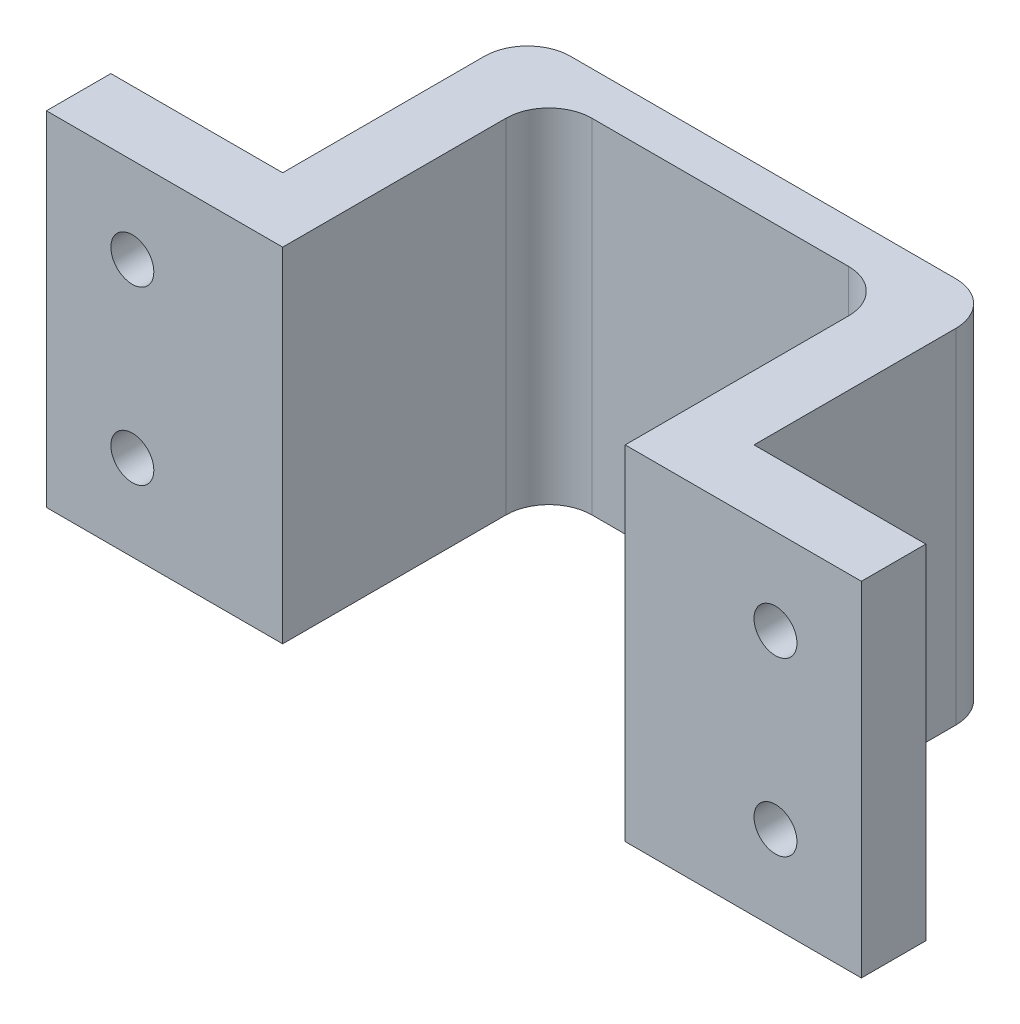
ISO-10303-21;
HEADER;
FILE_DESCRIPTION(('STEP AP214'),'2;1');
FILE_NAME('part.step','',(''),(''),'','','');
FILE_SCHEMA(('AUTOMOTIVE_DESIGN { 1 0 10303 214 1 1 1 1 }'));
ENDSEC;
DATA;
#1=APPLICATION_CONTEXT('core data for automotive mechanical design processes');
#2=APPLICATION_PROTOCOL_DEFINITION('international standard','automotive_design',2000,#1);
#3=PRODUCT_CONTEXT('',#1,'mechanical');
#4=PRODUCT('Part','Part','',(#3));
#5=PRODUCT_RELATED_PRODUCT_CATEGORY('part','',(#4));
#6=PRODUCT_DEFINITION_FORMATION('','',#4);
#7=PRODUCT_DEFINITION_CONTEXT('part definition',#1,'design');
#8=PRODUCT_DEFINITION('design','',#6,#7);
#9=PRODUCT_DEFINITION_SHAPE('','',#8);
#10=(LENGTH_UNIT() NAMED_UNIT(*) SI_UNIT(.MILLI.,.METRE.));
#11=(NAMED_UNIT(*) PLANE_ANGLE_UNIT() SI_UNIT($,.RADIAN.));
#12=(NAMED_UNIT(*) SI_UNIT($,.STERADIAN.) SOLID_ANGLE_UNIT());
#13=UNCERTAINTY_MEASURE_WITH_UNIT(LENGTH_MEASURE(1.E-05),#10,'distance_accuracy_value','');
#14=(GEOMETRIC_REPRESENTATION_CONTEXT(3) GLOBAL_UNCERTAINTY_ASSIGNED_CONTEXT((#13)) GLOBAL_UNIT_ASSIGNED_CONTEXT((#10,
#11,#12)) REPRESENTATION_CONTEXT('',''));
#15=CARTESIAN_POINT('',(0.,0.,0.));
#16=DIRECTION('',(0.,0.,1.));
#17=DIRECTION('',(1.,0.,0.));
#18=AXIS2_PLACEMENT_3D('',#15,#16,#17);
#19=CARTESIAN_POINT('',(0.,0.,2.));
#20=DIRECTION('',(1.,0.,0.));
#21=DIRECTION('',(0.,0.,-1.));
#22=AXIS2_PLACEMENT_3D('',#19,#20,#21);
#23=PLANE('',#22);
#24=DIRECTION('',(0.,0.,-1.));
#25=VECTOR('',#24,1.);
#26=CARTESIAN_POINT('',(0.,16.,2.));
#27=LINE('',#26,#25);
#28=CARTESIAN_POINT('',(0.,16.,11.4));
#29=VERTEX_POINT('',#28);
#30=CARTESIAN_POINT('',(0.,16.,2.));
#31=VERTEX_POINT('',#30);
#32=EDGE_CURVE('E234',#29,#31,#27,.T.);
#33=ORIENTED_EDGE('',*,*,#32,.T.);
#34=DIRECTION('',(0.,-1.,0.));
#35=VECTOR('',#34,1.);
#36=CARTESIAN_POINT('',(0.,0.,2.));
#37=LINE('',#36,#35);
#38=CARTESIAN_POINT('',(0.,0.,2.));
#39=VERTEX_POINT('',#38);
#40=EDGE_CURVE('E267',#31,#39,#37,.T.);
#41=ORIENTED_EDGE('',*,*,#40,.T.);
#42=DIRECTION('',(0.,0.,-1.));
#43=VECTOR('',#42,1.);
#44=CARTESIAN_POINT('',(0.,0.,2.));
#45=LINE('',#44,#43);
#46=CARTESIAN_POINT('',(0.,0.,11.4));
#47=VERTEX_POINT('',#46);
#48=EDGE_CURVE('E246',#47,#39,#45,.T.);
#49=ORIENTED_EDGE('',*,*,#48,.F.);
#50=DIRECTION('',(0.,-1.,0.));
#51=VECTOR('',#50,1.);
#52=CARTESIAN_POINT('',(0.,0.,11.4));
#53=LINE('',#52,#51);
#54=EDGE_CURVE('E174',#29,#47,#53,.T.);
#55=ORIENTED_EDGE('',*,*,#54,.F.);
#56=EDGE_LOOP('',(#33,#41,#49,#55));
#57=FACE_BOUND('',#56,.T.);
#58=ADVANCED_FACE('F33',(#57),#23,.F.);
#59=CARTESIAN_POINT('',(21.95,0.,2.));
#60=DIRECTION('',(-1.,0.,0.));
#61=DIRECTION('',(0.,0.,1.));
#62=AXIS2_PLACEMENT_3D('',#59,#60,#61);
#63=PLANE('',#62);
#64=DIRECTION('',(0.,0.,-1.));
#65=VECTOR('',#64,1.);
#66=CARTESIAN_POINT('',(21.95,0.,2.));
#67=LINE('',#66,#65);
#68=CARTESIAN_POINT('',(21.95,0.,11.4));
#69=VERTEX_POINT('',#68);
#70=CARTESIAN_POINT('',(21.95,0.,2.));
#71=VERTEX_POINT('',#70);
#72=EDGE_CURVE('E243',#69,#71,#67,.T.);
#73=ORIENTED_EDGE('',*,*,#72,.T.);
#74=DIRECTION('',(0.,1.,0.));
#75=VECTOR('',#74,1.);
#76=CARTESIAN_POINT('',(21.95,16.,2.));
#77=LINE('',#76,#75);
#78=CARTESIAN_POINT('',(21.95,16.,2.));
#79=VERTEX_POINT('',#78);
#80=EDGE_CURVE('E11',#71,#79,#77,.T.);
#81=ORIENTED_EDGE('',*,*,#80,.T.);
#82=DIRECTION('',(0.,0.,-1.));
#83=VECTOR('',#82,1.);
#84=CARTESIAN_POINT('',(21.95,16.,2.));
#85=LINE('',#84,#83);
#86=CARTESIAN_POINT('',(21.95,16.,11.4));
#87=VERTEX_POINT('',#86);
#88=EDGE_CURVE('E240',#87,#79,#85,.T.);
#89=ORIENTED_EDGE('',*,*,#88,.F.);
#90=DIRECTION('',(0.,1.,0.));
#91=VECTOR('',#90,1.);
#92=CARTESIAN_POINT('',(21.95,16.,11.4));
#93=LINE('',#92,#91);
#94=EDGE_CURVE('E188',#69,#87,#93,.T.);
#95=ORIENTED_EDGE('',*,*,#94,.F.);
#96=EDGE_LOOP('',(#73,#81,#89,#95));
#97=FACE_BOUND('',#96,.T.);
#98=ADVANCED_FACE('F289',(#97),#63,.F.);
#99=CARTESIAN_POINT('',(0.,0.,2.));
#100=DIRECTION('',(0.,0.,-1.));
#101=DIRECTION('',(-1.,0.,0.));
#102=AXIS2_PLACEMENT_3D('',#99,#100,#101);
#103=PLANE('',#102);
#104=DIRECTION('',(-1.,0.,0.));
#105=VECTOR('',#104,1.);
#106=CARTESIAN_POINT('',(0.,16.,2.));
#107=LINE('',#106,#105);
#108=CARTESIAN_POINT('',(16.95,16.,2.));
#109=VERTEX_POINT('',#108);
#110=CARTESIAN_POINT('',(5.,16.,2.));
#111=VERTEX_POINT('',#110);
#112=EDGE_CURVE('E230',#109,#111,#107,.T.);
#113=ORIENTED_EDGE('',*,*,#112,.T.);
#114=DIRECTION('',(0.,1.,0.));
#115=VECTOR('',#114,1.);
#116=CARTESIAN_POINT('',(5.,0.,2.));
#117=LINE('',#116,#115);
#118=CARTESIAN_POINT('',(5.,0.,2.));
#119=VERTEX_POINT('',#118);
#120=EDGE_CURVE('E254',#111,#119,#117,.F.);
#121=ORIENTED_EDGE('',*,*,#120,.T.);
#122=DIRECTION('',(1.,0.,0.));
#123=VECTOR('',#122,1.);
#124=CARTESIAN_POINT('',(0.,0.,2.));
#125=LINE('',#124,#123);
#126=CARTESIAN_POINT('',(16.95,0.,2.));
#127=VERTEX_POINT('',#126);
#128=EDGE_CURVE('E227',#119,#127,#125,.T.);
#129=ORIENTED_EDGE('',*,*,#128,.T.);
#130=DIRECTION('',(0.,-1.,0.));
#131=VECTOR('',#130,1.);
#132=CARTESIAN_POINT('',(16.95,16.,2.));
#133=LINE('',#132,#131);
#134=EDGE_CURVE('E252',#127,#109,#133,.F.);
#135=ORIENTED_EDGE('',*,*,#134,.T.);
#136=EDGE_LOOP('',(#113,#121,#129,#135));
#137=FACE_BOUND('',#136,.T.);
#138=ADVANCED_FACE('F315',(#137),#103,.F.);
#139=CARTESIAN_POINT('',(0.,0.,2.));
#140=DIRECTION('',(0.,1.,0.));
#141=DIRECTION('',(0.,0.,1.));
#142=AXIS2_PLACEMENT_3D('',#139,#140,#141);
#143=PLANE('',#142);
#144=ORIENTED_EDGE('',*,*,#48,.T.);
#145=CARTESIAN_POINT('',(2.,0.,2.));
#146=DIRECTION('',(0.,1.,0.));
#147=DIRECTION('',(0.,0.,1.));
#148=AXIS2_PLACEMENT_3D('',#145,#146,#147);
#149=CIRCLE('',#148,2.);
#150=CARTESIAN_POINT('',(2.,0.,0.));
#151=VERTEX_POINT('',#150);
#152=EDGE_CURVE('E272',#39,#151,#149,.F.);
#153=ORIENTED_EDGE('',*,*,#152,.T.);
#154=DIRECTION('',(1.,0.,0.));
#155=VECTOR('',#154,1.);
#156=CARTESIAN_POINT('',(0.,0.,0.));
#157=LINE('',#156,#155);
#158=CARTESIAN_POINT('',(19.95,0.,0.));
#159=VERTEX_POINT('',#158);
#160=EDGE_CURVE('E226',#151,#159,#157,.T.);
#161=ORIENTED_EDGE('',*,*,#160,.T.);
#162=CARTESIAN_POINT('',(19.95,0.,2.));
#163=DIRECTION('',(0.,1.,0.));
#164=DIRECTION('',(0.,0.,1.));
#165=AXIS2_PLACEMENT_3D('',#162,#163,#164);
#166=CIRCLE('',#165,2.);
#167=EDGE_CURVE('E270',#159,#71,#166,.F.);
#168=ORIENTED_EDGE('',*,*,#167,.T.);
#169=ORIENTED_EDGE('',*,*,#72,.F.);
#170=DIRECTION('',(-1.,0.,0.));
#171=VECTOR('',#170,1.);
#172=CARTESIAN_POINT('',(29.95,0.,11.4));
#173=LINE('',#172,#171);
#174=CARTESIAN_POINT('',(29.95,0.,11.4));
#175=VERTEX_POINT('',#174);
#176=EDGE_CURVE('E204',#175,#69,#173,.T.);
#177=ORIENTED_EDGE('',*,*,#176,.F.);
#178=DIRECTION('',(0.,0.,-1.));
#179=VECTOR('',#178,1.);
#180=CARTESIAN_POINT('',(29.95,0.,14.4));
#181=LINE('',#180,#179);
#182=CARTESIAN_POINT('',(29.95,0.,14.4));
#183=VERTEX_POINT('',#182);
#184=EDGE_CURVE('E192',#183,#175,#181,.T.);
#185=ORIENTED_EDGE('',*,*,#184,.F.);
#186=DIRECTION('',(1.,0.,0.));
#187=VECTOR('',#186,1.);
#188=CARTESIAN_POINT('',(21.95,0.,14.4));
#189=LINE('',#188,#187);
#190=CARTESIAN_POINT('',(18.95,0.,14.4));
#191=VERTEX_POINT('',#190);
#192=EDGE_CURVE('E211',#191,#183,#189,.T.);
#193=ORIENTED_EDGE('',*,*,#192,.F.);
#194=DIRECTION('',(0.,0.,-1.));
#195=VECTOR('',#194,1.);
#196=CARTESIAN_POINT('',(18.95,0.,14.4));
#197=LINE('',#196,#195);
#198=CARTESIAN_POINT('',(18.95,0.,4.));
#199=VERTEX_POINT('',#198);
#200=EDGE_CURVE('E213',#191,#199,#197,.T.);
#201=ORIENTED_EDGE('',*,*,#200,.T.);
#202=CARTESIAN_POINT('',(16.95,0.,4.));
#203=DIRECTION('',(0.,1.,0.));
#204=DIRECTION('',(0.,0.,1.));
#205=AXIS2_PLACEMENT_3D('',#202,#203,#204);
#206=CIRCLE('',#205,2.);
#207=EDGE_CURVE('E263',#199,#127,#206,.T.);
#208=ORIENTED_EDGE('',*,*,#207,.T.);
#209=ORIENTED_EDGE('',*,*,#128,.F.);
#210=CARTESIAN_POINT('',(5.,0.,4.));
#211=DIRECTION('',(0.,1.,0.));
#212=DIRECTION('',(0.,0.,1.));
#213=AXIS2_PLACEMENT_3D('',#210,#211,#212);
#214=CIRCLE('',#213,2.);
#215=CARTESIAN_POINT('',(3.,0.,4.));
#216=VERTEX_POINT('',#215);
#217=EDGE_CURVE('E261',#119,#216,#214,.T.);
#218=ORIENTED_EDGE('',*,*,#217,.T.);
#219=DIRECTION('',(0.,0.,-1.));
#220=VECTOR('',#219,1.);
#221=CARTESIAN_POINT('',(3.,0.,14.4));
#222=LINE('',#221,#220);
#223=CARTESIAN_POINT('',(3.,0.,14.4));
#224=VERTEX_POINT('',#223);
#225=EDGE_CURVE('E223',#224,#216,#222,.T.);
#226=ORIENTED_EDGE('',*,*,#225,.F.);
#227=DIRECTION('',(1.,0.,0.));
#228=VECTOR('',#227,1.);
#229=CARTESIAN_POINT('',(0.,0.,14.4));
#230=LINE('',#229,#228);
#231=CARTESIAN_POINT('',(-8.,0.,14.4));
#232=VERTEX_POINT('',#231);
#233=EDGE_CURVE('E219',#232,#224,#230,.T.);
#234=ORIENTED_EDGE('',*,*,#233,.F.);
#235=DIRECTION('',(0.,0.,1.));
#236=VECTOR('',#235,1.);
#237=CARTESIAN_POINT('',(-8.,0.,14.4));
#238=LINE('',#237,#236);
#239=CARTESIAN_POINT('',(-8.,0.,11.4));
#240=VERTEX_POINT('',#239);
#241=EDGE_CURVE('E173',#240,#232,#238,.T.);
#242=ORIENTED_EDGE('',*,*,#241,.F.);
#243=DIRECTION('',(1.,0.,0.));
#244=VECTOR('',#243,1.);
#245=CARTESIAN_POINT('',(-8.,0.,11.4));
#246=LINE('',#245,#244);
#247=EDGE_CURVE('E183',#240,#47,#246,.T.);
#248=ORIENTED_EDGE('',*,*,#247,.T.);
#249=EDGE_LOOP('',(#144,#153,#161,#168,#169,#177,#185,#193,#201,#208,#209,#218,#226,#234,#242,#248));
#250=FACE_BOUND('',#249,.T.);
#251=ADVANCED_FACE('F283',(#250),#143,.F.);
#252=CARTESIAN_POINT('',(0.,16.,2.));
#253=DIRECTION('',(0.,-1.,0.));
#254=DIRECTION('',(0.,0.,-1.));
#255=AXIS2_PLACEMENT_3D('',#252,#253,#254);
#256=PLANE('',#255);
#257=DIRECTION('',(-1.,0.,0.));
#258=VECTOR('',#257,1.);
#259=CARTESIAN_POINT('',(0.,16.,0.));
#260=LINE('',#259,#258);
#261=CARTESIAN_POINT('',(19.95,16.,0.));
#262=VERTEX_POINT('',#261);
#263=CARTESIAN_POINT('',(2.,16.,0.));
#264=VERTEX_POINT('',#263);
#265=EDGE_CURVE('E231',#262,#264,#260,.T.);
#266=ORIENTED_EDGE('',*,*,#265,.T.);
#267=CARTESIAN_POINT('',(2.,16.,2.));
#268=DIRECTION('',(0.,-1.,0.));
#269=DIRECTION('',(0.,0.,-1.));
#270=AXIS2_PLACEMENT_3D('',#267,#268,#269);
#271=CIRCLE('',#270,2.);
#272=EDGE_CURVE('E41',#264,#31,#271,.F.);
#273=ORIENTED_EDGE('',*,*,#272,.T.);
#274=ORIENTED_EDGE('',*,*,#32,.F.);
#275=DIRECTION('',(1.,0.,0.));
#276=VECTOR('',#275,1.);
#277=CARTESIAN_POINT('',(-8.,16.,11.4));
#278=LINE('',#277,#276);
#279=CARTESIAN_POINT('',(-8.,16.,11.4));
#280=VERTEX_POINT('',#279);
#281=EDGE_CURVE('E165',#280,#29,#278,.T.);
#282=ORIENTED_EDGE('',*,*,#281,.F.);
#283=DIRECTION('',(0.,0.,-1.));
#284=VECTOR('',#283,1.);
#285=CARTESIAN_POINT('',(-8.,16.,14.4));
#286=LINE('',#285,#284);
#287=CARTESIAN_POINT('',(-8.,16.,14.4));
#288=VERTEX_POINT('',#287);
#289=EDGE_CURVE('E161',#288,#280,#286,.T.);
#290=ORIENTED_EDGE('',*,*,#289,.F.);
#291=DIRECTION('',(-1.,0.,0.));
#292=VECTOR('',#291,1.);
#293=CARTESIAN_POINT('',(0.,16.,14.4));
#294=LINE('',#293,#292);
#295=CARTESIAN_POINT('',(3.,16.,14.4));
#296=VERTEX_POINT('',#295);
#297=EDGE_CURVE('E148',#296,#288,#294,.T.);
#298=ORIENTED_EDGE('',*,*,#297,.F.);
#299=DIRECTION('',(0.,0.,-1.));
#300=VECTOR('',#299,1.);
#301=CARTESIAN_POINT('',(3.,16.,14.4));
#302=LINE('',#301,#300);
#303=CARTESIAN_POINT('',(3.,16.,4.));
#304=VERTEX_POINT('',#303);
#305=EDGE_CURVE('E158',#296,#304,#302,.T.);
#306=ORIENTED_EDGE('',*,*,#305,.T.);
#307=CARTESIAN_POINT('',(5.,16.,4.));
#308=DIRECTION('',(0.,-1.,0.));
#309=DIRECTION('',(0.,0.,-1.));
#310=AXIS2_PLACEMENT_3D('',#307,#308,#309);
#311=CIRCLE('',#310,2.);
#312=EDGE_CURVE('E259',#304,#111,#311,.T.);
#313=ORIENTED_EDGE('',*,*,#312,.T.);
#314=ORIENTED_EDGE('',*,*,#112,.F.);
#315=CARTESIAN_POINT('',(16.95,16.,4.));
#316=DIRECTION('',(0.,-1.,0.));
#317=DIRECTION('',(0.,0.,-1.));
#318=AXIS2_PLACEMENT_3D('',#315,#316,#317);
#319=CIRCLE('',#318,2.);
#320=CARTESIAN_POINT('',(18.95,16.,4.));
#321=VERTEX_POINT('',#320);
#322=EDGE_CURVE('E265',#109,#321,#319,.T.);
#323=ORIENTED_EDGE('',*,*,#322,.T.);
#324=DIRECTION('',(0.,0.,-1.));
#325=VECTOR('',#324,1.);
#326=CARTESIAN_POINT('',(18.95,16.,14.4));
#327=LINE('',#326,#325);
#328=CARTESIAN_POINT('',(18.95,16.,14.4));
#329=VERTEX_POINT('',#328);
#330=EDGE_CURVE('E216',#329,#321,#327,.T.);
#331=ORIENTED_EDGE('',*,*,#330,.F.);
#332=DIRECTION('',(-1.,0.,0.));
#333=VECTOR('',#332,1.);
#334=CARTESIAN_POINT('',(21.95,16.,14.4));
#335=LINE('',#334,#333);
#336=CARTESIAN_POINT('',(29.95,16.,14.4));
#337=VERTEX_POINT('',#336);
#338=EDGE_CURVE('E207',#337,#329,#335,.T.);
#339=ORIENTED_EDGE('',*,*,#338,.F.);
#340=DIRECTION('',(0.,0.,1.));
#341=VECTOR('',#340,1.);
#342=CARTESIAN_POINT('',(29.95,16.,14.4));
#343=LINE('',#342,#341);
#344=CARTESIAN_POINT('',(29.95,16.,11.4));
#345=VERTEX_POINT('',#344);
#346=EDGE_CURVE('E196',#345,#337,#343,.T.);
#347=ORIENTED_EDGE('',*,*,#346,.F.);
#348=DIRECTION('',(-1.,0.,0.));
#349=VECTOR('',#348,1.);
#350=CARTESIAN_POINT('',(29.95,16.,11.4));
#351=LINE('',#350,#349);
#352=EDGE_CURVE('E199',#345,#87,#351,.T.);
#353=ORIENTED_EDGE('',*,*,#352,.T.);
#354=ORIENTED_EDGE('',*,*,#88,.T.);
#355=CARTESIAN_POINT('',(19.95,16.,2.));
#356=DIRECTION('',(0.,-1.,0.));
#357=DIRECTION('',(0.,0.,-1.));
#358=AXIS2_PLACEMENT_3D('',#355,#356,#357);
#359=CIRCLE('',#358,2.);
#360=EDGE_CURVE('E48',#79,#262,#359,.F.);
#361=ORIENTED_EDGE('',*,*,#360,.T.);
#362=EDGE_LOOP('',(#266,#273,#274,#282,#290,#298,#306,#313,#314,#323,#331,#339,#347,#353,#354,#361));
#363=FACE_BOUND('',#362,.T.);
#364=ADVANCED_FACE('F162',(#363),#256,.F.);
#365=CARTESIAN_POINT('',(0.,0.,0.));
#366=DIRECTION('',(0.,0.,-1.));
#367=DIRECTION('',(-1.,0.,0.));
#368=AXIS2_PLACEMENT_3D('',#365,#366,#367);
#369=PLANE('',#368);
#370=ORIENTED_EDGE('',*,*,#160,.F.);
#371=DIRECTION('',(0.,-1.,0.));
#372=VECTOR('',#371,1.);
#373=CARTESIAN_POINT('',(2.,16.,0.));
#374=LINE('',#373,#372);
#375=EDGE_CURVE('E55',#151,#264,#374,.F.);
#376=ORIENTED_EDGE('',*,*,#375,.T.);
#377=ORIENTED_EDGE('',*,*,#265,.F.);
#378=DIRECTION('',(0.,1.,0.));
#379=VECTOR('',#378,1.);
#380=CARTESIAN_POINT('',(19.95,0.,0.));
#381=LINE('',#380,#379);
#382=EDGE_CURVE('E274',#262,#159,#381,.F.);
#383=ORIENTED_EDGE('',*,*,#382,.T.);
#384=EDGE_LOOP('',(#370,#376,#377,#383));
#385=FACE_BOUND('',#384,.T.);
#386=ADVANCED_FACE('F285',(#385),#369,.T.);
#387=CARTESIAN_POINT('',(3.,16.,14.4));
#388=DIRECTION('',(-1.,0.,0.));
#389=DIRECTION('',(0.,-1.,0.));
#390=AXIS2_PLACEMENT_3D('',#387,#388,#389);
#391=PLANE('',#390);
#392=ORIENTED_EDGE('',*,*,#225,.T.);
#393=DIRECTION('',(0.,1.,0.));
#394=VECTOR('',#393,1.);
#395=CARTESIAN_POINT('',(3.,16.,4.));
#396=LINE('',#395,#394);
#397=EDGE_CURVE('E249',#216,#304,#396,.T.);
#398=ORIENTED_EDGE('',*,*,#397,.T.);
#399=ORIENTED_EDGE('',*,*,#305,.F.);
#400=DIRECTION('',(0.,1.,0.));
#401=VECTOR('',#400,1.);
#402=CARTESIAN_POINT('',(3.,16.,14.4));
#403=LINE('',#402,#401);
#404=EDGE_CURVE('E154',#224,#296,#403,.T.);
#405=ORIENTED_EDGE('',*,*,#404,.F.);
#406=EDGE_LOOP('',(#392,#398,#399,#405));
#407=FACE_BOUND('',#406,.T.);
#408=ADVANCED_FACE('F322',(#407),#391,.F.);
#409=CARTESIAN_POINT('',(0.,0.,14.4));
#410=DIRECTION('',(0.,0.,1.));
#411=DIRECTION('',(1.,0.,0.));
#412=AXIS2_PLACEMENT_3D('',#409,#410,#411);
#413=PLANE('',#412);
#414=CARTESIAN_POINT('',(-4.,12.,14.4));
#415=DIRECTION('',(0.,0.,1.));
#416=DIRECTION('',(1.,0.,0.));
#417=AXIS2_PLACEMENT_3D('',#414,#415,#416);
#418=CIRCLE('',#417,1.);
#419=CARTESIAN_POINT('',(-3.,12.,14.4));
#420=VERTEX_POINT('',#419);
#421=EDGE_CURVE('E556',#420,#420,#418,.T.);
#422=ORIENTED_EDGE('',*,*,#421,.F.);
#423=EDGE_LOOP('',(#422));
#424=FACE_BOUND('',#423,.T.);
#425=CARTESIAN_POINT('',(-4.,4.,14.4));
#426=DIRECTION('',(0.,0.,1.));
#427=DIRECTION('',(1.,0.,0.));
#428=AXIS2_PLACEMENT_3D('',#425,#426,#427);
#429=CIRCLE('',#428,1.);
#430=CARTESIAN_POINT('',(-3.,4.,14.4));
#431=VERTEX_POINT('',#430);
#432=EDGE_CURVE('E177',#431,#431,#429,.T.);
#433=ORIENTED_EDGE('',*,*,#432,.F.);
#434=EDGE_LOOP('',(#433));
#435=FACE_BOUND('',#434,.T.);
#436=ORIENTED_EDGE('',*,*,#297,.T.);
#437=DIRECTION('',(0.,1.,0.));
#438=VECTOR('',#437,1.);
#439=CARTESIAN_POINT('',(-8.,0.,14.4));
#440=LINE('',#439,#438);
#441=EDGE_CURVE('E152',#232,#288,#440,.T.);
#442=ORIENTED_EDGE('',*,*,#441,.F.);
#443=ORIENTED_EDGE('',*,*,#233,.T.);
#444=ORIENTED_EDGE('',*,*,#404,.T.);
#445=EDGE_LOOP('',(#436,#442,#443,#444));
#446=FACE_BOUND('',#445,.T.);
#447=ADVANCED_FACE('F150',(#424,#435,#446),#413,.T.);
#448=CARTESIAN_POINT('',(18.95,16.,14.4));
#449=DIRECTION('',(1.,0.,0.));
#450=DIRECTION('',(0.,1.,0.));
#451=AXIS2_PLACEMENT_3D('',#448,#449,#450);
#452=PLANE('',#451);
#453=ORIENTED_EDGE('',*,*,#330,.T.);
#454=DIRECTION('',(0.,-1.,0.));
#455=VECTOR('',#454,1.);
#456=CARTESIAN_POINT('',(18.95,0.,4.));
#457=LINE('',#456,#455);
#458=EDGE_CURVE('E256',#321,#199,#457,.T.);
#459=ORIENTED_EDGE('',*,*,#458,.T.);
#460=ORIENTED_EDGE('',*,*,#200,.F.);
#461=DIRECTION('',(0.,-1.,0.));
#462=VECTOR('',#461,1.);
#463=CARTESIAN_POINT('',(18.95,16.,14.4));
#464=LINE('',#463,#462);
#465=EDGE_CURVE('E209',#329,#191,#464,.T.);
#466=ORIENTED_EDGE('',*,*,#465,.F.);
#467=EDGE_LOOP('',(#453,#459,#460,#466));
#468=FACE_BOUND('',#467,.T.);
#469=ADVANCED_FACE('F307',(#468),#452,.F.);
#470=CARTESIAN_POINT('',(0.,0.,14.4));
#471=DIRECTION('',(0.,0.,-1.));
#472=DIRECTION('',(-1.,0.,0.));
#473=AXIS2_PLACEMENT_3D('',#470,#471,#472);
#474=PLANE('',#473);
#475=CARTESIAN_POINT('',(25.95,4.,14.4));
#476=DIRECTION('',(0.,0.,-1.));
#477=DIRECTION('',(-1.,0.,0.));
#478=AXIS2_PLACEMENT_3D('',#475,#476,#477);
#479=CIRCLE('',#478,1.);
#480=CARTESIAN_POINT('',(24.95,4.,14.4));
#481=VERTEX_POINT('',#480);
#482=EDGE_CURVE('E562',#481,#481,#479,.T.);
#483=ORIENTED_EDGE('',*,*,#482,.T.);
#484=EDGE_LOOP('',(#483));
#485=FACE_BOUND('',#484,.T.);
#486=CARTESIAN_POINT('',(25.95,12.,14.4));
#487=DIRECTION('',(0.,0.,-1.));
#488=DIRECTION('',(-1.,0.,0.));
#489=AXIS2_PLACEMENT_3D('',#486,#487,#488);
#490=CIRCLE('',#489,1.);
#491=CARTESIAN_POINT('',(24.95,12.,14.4));
#492=VERTEX_POINT('',#491);
#493=EDGE_CURVE('E559',#492,#492,#490,.T.);
#494=ORIENTED_EDGE('',*,*,#493,.T.);
#495=EDGE_LOOP('',(#494));
#496=FACE_BOUND('',#495,.T.);
#497=ORIENTED_EDGE('',*,*,#192,.T.);
#498=DIRECTION('',(0.,-1.,0.));
#499=VECTOR('',#498,1.);
#500=CARTESIAN_POINT('',(29.95,16.,14.4));
#501=LINE('',#500,#499);
#502=EDGE_CURVE('E189',#337,#183,#501,.T.);
#503=ORIENTED_EDGE('',*,*,#502,.F.);
#504=ORIENTED_EDGE('',*,*,#338,.T.);
#505=ORIENTED_EDGE('',*,*,#465,.T.);
#506=EDGE_LOOP('',(#497,#503,#504,#505));
#507=FACE_BOUND('',#506,.T.);
#508=ADVANCED_FACE('F300',(#485,#496,#507),#474,.F.);
#509=CARTESIAN_POINT('',(29.95,16.,11.4));
#510=DIRECTION('',(0.,0.,1.));
#511=DIRECTION('',(0.,-1.,0.));
#512=AXIS2_PLACEMENT_3D('',#509,#510,#511);
#513=PLANE('',#512);
#514=CARTESIAN_POINT('',(25.95,4.,11.4));
#515=DIRECTION('',(0.,0.,-1.));
#516=DIRECTION('',(-1.,0.,0.));
#517=AXIS2_PLACEMENT_3D('',#514,#515,#516);
#518=CIRCLE('',#517,1.);
#519=CARTESIAN_POINT('',(24.95,4.,11.4));
#520=VERTEX_POINT('',#519);
#521=EDGE_CURVE('E546',#520,#520,#518,.T.);
#522=ORIENTED_EDGE('',*,*,#521,.F.);
#523=EDGE_LOOP('',(#522));
#524=FACE_BOUND('',#523,.T.);
#525=CARTESIAN_POINT('',(25.95,12.,11.4));
#526=DIRECTION('',(0.,0.,-1.));
#527=DIRECTION('',(-1.,0.,0.));
#528=AXIS2_PLACEMENT_3D('',#525,#526,#527);
#529=CIRCLE('',#528,1.);
#530=CARTESIAN_POINT('',(24.95,12.,11.4));
#531=VERTEX_POINT('',#530);
#532=EDGE_CURVE('E549',#531,#531,#529,.T.);
#533=ORIENTED_EDGE('',*,*,#532,.F.);
#534=EDGE_LOOP('',(#533));
#535=FACE_BOUND('',#534,.T.);
#536=ORIENTED_EDGE('',*,*,#94,.T.);
#537=ORIENTED_EDGE('',*,*,#352,.F.);
#538=DIRECTION('',(0.,1.,0.));
#539=VECTOR('',#538,1.);
#540=CARTESIAN_POINT('',(29.95,16.,11.4));
#541=LINE('',#540,#539);
#542=EDGE_CURVE('E194',#175,#345,#541,.T.);
#543=ORIENTED_EDGE('',*,*,#542,.F.);
#544=ORIENTED_EDGE('',*,*,#176,.T.);
#545=EDGE_LOOP('',(#536,#537,#543,#544));
#546=FACE_BOUND('',#545,.T.);
#547=ADVANCED_FACE('F292',(#524,#535,#546),#513,.F.);
#548=CARTESIAN_POINT('',(29.95,0.,0.));
#549=DIRECTION('',(1.,0.,0.));
#550=DIRECTION('',(0.,0.,-1.));
#551=AXIS2_PLACEMENT_3D('',#548,#549,#550);
#552=PLANE('',#551);
#553=ORIENTED_EDGE('',*,*,#502,.T.);
#554=ORIENTED_EDGE('',*,*,#184,.T.);
#555=ORIENTED_EDGE('',*,*,#542,.T.);
#556=ORIENTED_EDGE('',*,*,#346,.T.);
#557=EDGE_LOOP('',(#553,#554,#555,#556));
#558=FACE_BOUND('',#557,.T.);
#559=ADVANCED_FACE('F298',(#558),#552,.T.);
#560=CARTESIAN_POINT('',(-8.,0.,11.4));
#561=DIRECTION('',(0.,0.,1.));
#562=DIRECTION('',(1.,0.,0.));
#563=AXIS2_PLACEMENT_3D('',#560,#561,#562);
#564=PLANE('',#563);
#565=CARTESIAN_POINT('',(-4.,12.,11.4));
#566=DIRECTION('',(0.,0.,-1.));
#567=DIRECTION('',(-1.,0.,0.));
#568=AXIS2_PLACEMENT_3D('',#565,#566,#567);
#569=CIRCLE('',#568,1.);
#570=CARTESIAN_POINT('',(-5.,12.,11.4));
#571=VERTEX_POINT('',#570);
#572=EDGE_CURVE('E550',#571,#571,#569,.T.);
#573=ORIENTED_EDGE('',*,*,#572,.F.);
#574=EDGE_LOOP('',(#573));
#575=FACE_BOUND('',#574,.T.);
#576=CARTESIAN_POINT('',(-4.,4.,11.4));
#577=DIRECTION('',(0.,0.,-1.));
#578=DIRECTION('',(-1.,0.,0.));
#579=AXIS2_PLACEMENT_3D('',#576,#577,#578);
#580=CIRCLE('',#579,1.);
#581=CARTESIAN_POINT('',(-5.,4.,11.4));
#582=VERTEX_POINT('',#581);
#583=EDGE_CURVE('E564',#582,#582,#580,.T.);
#584=ORIENTED_EDGE('',*,*,#583,.F.);
#585=EDGE_LOOP('',(#584));
#586=FACE_BOUND('',#585,.T.);
#587=ORIENTED_EDGE('',*,*,#54,.T.);
#588=ORIENTED_EDGE('',*,*,#247,.F.);
#589=DIRECTION('',(0.,-1.,0.));
#590=VECTOR('',#589,1.);
#591=CARTESIAN_POINT('',(-8.,0.,11.4));
#592=LINE('',#591,#590);
#593=EDGE_CURVE('E168',#280,#240,#592,.T.);
#594=ORIENTED_EDGE('',*,*,#593,.F.);
#595=ORIENTED_EDGE('',*,*,#281,.T.);
#596=EDGE_LOOP('',(#587,#588,#594,#595));
#597=FACE_BOUND('',#596,.T.);
#598=ADVANCED_FACE('F326',(#575,#586,#597),#564,.F.);
#599=CARTESIAN_POINT('',(-8.,0.,0.));
#600=DIRECTION('',(-1.,0.,0.));
#601=DIRECTION('',(0.,0.,1.));
#602=AXIS2_PLACEMENT_3D('',#599,#600,#601);
#603=PLANE('',#602);
#604=ORIENTED_EDGE('',*,*,#441,.T.);
#605=ORIENTED_EDGE('',*,*,#289,.T.);
#606=ORIENTED_EDGE('',*,*,#593,.T.);
#607=ORIENTED_EDGE('',*,*,#241,.T.);
#608=EDGE_LOOP('',(#604,#605,#606,#607));
#609=FACE_BOUND('',#608,.T.);
#610=ADVANCED_FACE('F171',(#609),#603,.T.);
#611=CARTESIAN_POINT('',(-4.,4.,19.4));
#612=DIRECTION('',(0.,0.,-1.));
#613=DIRECTION('',(-1.,0.,0.));
#614=AXIS2_PLACEMENT_3D('',#611,#612,#613);
#615=CYLINDRICAL_SURFACE('',#614,1.);
#616=ORIENTED_EDGE('',*,*,#432,.T.);
#617=EDGE_LOOP('',(#616));
#618=FACE_BOUND('',#617,.T.);
#619=ORIENTED_EDGE('',*,*,#583,.T.);
#620=EDGE_LOOP('',(#619));
#621=FACE_BOUND('',#620,.T.);
#622=ADVANCED_FACE('F334',(#618,#621),#615,.F.);
#623=CARTESIAN_POINT('',(-4.,12.,19.4));
#624=DIRECTION('',(0.,0.,-1.));
#625=DIRECTION('',(-1.,0.,0.));
#626=AXIS2_PLACEMENT_3D('',#623,#624,#625);
#627=CYLINDRICAL_SURFACE('',#626,1.);
#628=ORIENTED_EDGE('',*,*,#421,.T.);
#629=EDGE_LOOP('',(#628));
#630=FACE_BOUND('',#629,.T.);
#631=ORIENTED_EDGE('',*,*,#572,.T.);
#632=EDGE_LOOP('',(#631));
#633=FACE_BOUND('',#632,.T.);
#634=ADVANCED_FACE('F439',(#630,#633),#627,.F.);
#635=CARTESIAN_POINT('',(25.95,12.,19.4));
#636=DIRECTION('',(0.,0.,-1.));
#637=DIRECTION('',(-1.,0.,0.));
#638=AXIS2_PLACEMENT_3D('',#635,#636,#637);
#639=CYLINDRICAL_SURFACE('',#638,1.);
#640=ORIENTED_EDGE('',*,*,#532,.T.);
#641=EDGE_LOOP('',(#640));
#642=FACE_BOUND('',#641,.T.);
#643=ORIENTED_EDGE('',*,*,#493,.F.);
#644=EDGE_LOOP('',(#643));
#645=FACE_BOUND('',#644,.T.);
#646=ADVANCED_FACE('F434',(#642,#645),#639,.F.);
#647=CARTESIAN_POINT('',(25.95,4.,19.4));
#648=DIRECTION('',(0.,0.,-1.));
#649=DIRECTION('',(-1.,0.,0.));
#650=AXIS2_PLACEMENT_3D('',#647,#648,#649);
#651=CYLINDRICAL_SURFACE('',#650,1.);
#652=ORIENTED_EDGE('',*,*,#521,.T.);
#653=EDGE_LOOP('',(#652));
#654=FACE_BOUND('',#653,.T.);
#655=ORIENTED_EDGE('',*,*,#482,.F.);
#656=EDGE_LOOP('',(#655));
#657=FACE_BOUND('',#656,.T.);
#658=ADVANCED_FACE('F350',(#654,#657),#651,.F.);
#659=CARTESIAN_POINT('',(5.,16.,4.));
#660=DIRECTION('',(0.,-1.,0.));
#661=DIRECTION('',(1.,0.,0.));
#662=AXIS2_PLACEMENT_3D('',#659,#660,#661);
#663=CYLINDRICAL_SURFACE('',#662,2.);
#664=ORIENTED_EDGE('',*,*,#217,.F.);
#665=ORIENTED_EDGE('',*,*,#120,.F.);
#666=ORIENTED_EDGE('',*,*,#312,.F.);
#667=ORIENTED_EDGE('',*,*,#397,.F.);
#668=EDGE_LOOP('',(#664,#665,#666,#667));
#669=FACE_BOUND('',#668,.T.);
#670=ADVANCED_FACE('F320',(#669),#663,.F.);
#671=CARTESIAN_POINT('',(16.95,16.,4.));
#672=DIRECTION('',(0.,1.,0.));
#673=DIRECTION('',(-1.,0.,0.));
#674=AXIS2_PLACEMENT_3D('',#671,#672,#673);
#675=CYLINDRICAL_SURFACE('',#674,2.);
#676=ORIENTED_EDGE('',*,*,#322,.F.);
#677=ORIENTED_EDGE('',*,*,#134,.F.);
#678=ORIENTED_EDGE('',*,*,#207,.F.);
#679=ORIENTED_EDGE('',*,*,#458,.F.);
#680=EDGE_LOOP('',(#676,#677,#678,#679));
#681=FACE_BOUND('',#680,.T.);
#682=ADVANCED_FACE('F311',(#681),#675,.F.);
#683=CARTESIAN_POINT('',(2.,0.,2.));
#684=DIRECTION('',(0.,1.,0.));
#685=DIRECTION('',(0.,0.,1.));
#686=AXIS2_PLACEMENT_3D('',#683,#684,#685);
#687=CYLINDRICAL_SURFACE('',#686,2.);
#688=ORIENTED_EDGE('',*,*,#272,.F.);
#689=ORIENTED_EDGE('',*,*,#375,.F.);
#690=ORIENTED_EDGE('',*,*,#152,.F.);
#691=ORIENTED_EDGE('',*,*,#40,.F.);
#692=EDGE_LOOP('',(#688,#689,#690,#691));
#693=FACE_BOUND('',#692,.T.);
#694=ADVANCED_FACE('F281',(#693),#687,.T.);
#695=CARTESIAN_POINT('',(19.95,0.,2.));
#696=DIRECTION('',(0.,-1.,0.));
#697=DIRECTION('',(0.,0.,-1.));
#698=AXIS2_PLACEMENT_3D('',#695,#696,#697);
#699=CYLINDRICAL_SURFACE('',#698,2.);
#700=ORIENTED_EDGE('',*,*,#167,.F.);
#701=ORIENTED_EDGE('',*,*,#382,.F.);
#702=ORIENTED_EDGE('',*,*,#360,.F.);
#703=ORIENTED_EDGE('',*,*,#80,.F.);
#704=EDGE_LOOP('',(#700,#701,#702,#703));
#705=FACE_BOUND('',#704,.T.);
#706=ADVANCED_FACE('F35',(#705),#699,.T.);
#707=CLOSED_SHELL('',(#58,#98,#138,#251,#364,#386,#408,#447,#469,#508,#547,#559,#598,#610,#622,
#634,#646,#658,#670,#682,#694,#706));
#708=MANIFOLD_SOLID_BREP('B2',#707);
#709=ADVANCED_BREP_SHAPE_REPRESENTATION('',(#18,#708),#14);
#710=SHAPE_DEFINITION_REPRESENTATION(#9,#709);
ENDSEC;
END-ISO-10303-21;
